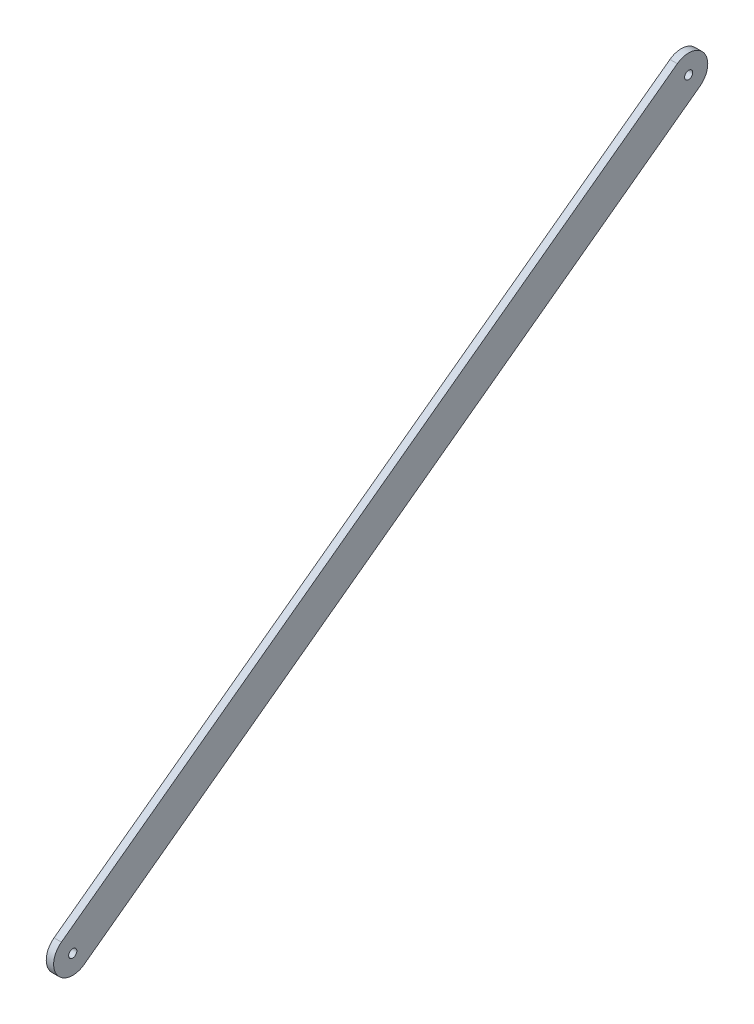
ISO-10303-21;
HEADER;
FILE_DESCRIPTION(('STEP AP214'),'2;1');
FILE_NAME('part.step','',(''),(''),'','','');
FILE_SCHEMA(('AUTOMOTIVE_DESIGN { 1 0 10303 214 1 1 1 1 }'));
ENDSEC;
DATA;
#1=APPLICATION_CONTEXT('core data for automotive mechanical design processes');
#2=APPLICATION_PROTOCOL_DEFINITION('international standard','automotive_design',2000,#1);
#3=PRODUCT_CONTEXT('',#1,'mechanical');
#4=PRODUCT('Part','Part','',(#3));
#5=PRODUCT_RELATED_PRODUCT_CATEGORY('part','',(#4));
#6=PRODUCT_DEFINITION_FORMATION('','',#4);
#7=PRODUCT_DEFINITION_CONTEXT('part definition',#1,'design');
#8=PRODUCT_DEFINITION('design','',#6,#7);
#9=PRODUCT_DEFINITION_SHAPE('','',#8);
#10=(LENGTH_UNIT() NAMED_UNIT(*) SI_UNIT(.MILLI.,.METRE.));
#11=(NAMED_UNIT(*) PLANE_ANGLE_UNIT() SI_UNIT($,.RADIAN.));
#12=(NAMED_UNIT(*) SI_UNIT($,.STERADIAN.) SOLID_ANGLE_UNIT());
#13=UNCERTAINTY_MEASURE_WITH_UNIT(LENGTH_MEASURE(1.E-05),#10,'distance_accuracy_value','');
#14=(GEOMETRIC_REPRESENTATION_CONTEXT(3) GLOBAL_UNCERTAINTY_ASSIGNED_CONTEXT((#13)) GLOBAL_UNIT_ASSIGNED_CONTEXT((#10,
#11,#12)) REPRESENTATION_CONTEXT('',''));
#15=CARTESIAN_POINT('',(0.,0.,0.));
#16=DIRECTION('',(0.,0.,1.));
#17=DIRECTION('',(1.,0.,0.));
#18=AXIS2_PLACEMENT_3D('',#15,#16,#17);
#19=CARTESIAN_POINT('',(-6.39999999999995,88.6597836815375,395.350407210465));
#20=DIRECTION('',(-1.,0.,0.));
#21=DIRECTION('',(0.,0.,1.));
#22=AXIS2_PLACEMENT_3D('',#19,#20,#21);
#23=PLANE('',#22);
#24=CARTESIAN_POINT('',(-6.39999999999991,88.6597836815375,395.350407210465));
#25=DIRECTION('',(-1.,0.,0.));
#26=DIRECTION('',(0.,0.,1.));
#27=AXIS2_PLACEMENT_3D('',#24,#25,#26);
#28=CIRCLE('',#27,1.6);
#29=CARTESIAN_POINT('',(-6.39999999999991,88.6597836815375,396.950407210465));
#30=VERTEX_POINT('',#29);
#31=EDGE_CURVE('E118',#30,#30,#28,.T.);
#32=ORIENTED_EDGE('',*,*,#31,.F.);
#33=EDGE_LOOP('',(#32));
#34=FACE_BOUND('',#33,.T.);
#35=CARTESIAN_POINT('',(-6.39999999999997,266.341700740396,153.629211718036));
#36=DIRECTION('',(-1.,0.,0.));
#37=DIRECTION('',(0.,0.,1.));
#38=AXIS2_PLACEMENT_3D('',#35,#36,#37);
#39=CIRCLE('',#38,1.59999999999999);
#40=CARTESIAN_POINT('',(-6.39999999999997,266.341700740396,155.229211718036));
#41=VERTEX_POINT('',#40);
#42=EDGE_CURVE('E112',#41,#41,#39,.T.);
#43=ORIENTED_EDGE('',*,*,#42,.F.);
#44=EDGE_LOOP('',(#43));
#45=FACE_BOUND('',#44,.T.);
#46=CARTESIAN_POINT('',(-6.39999999999995,88.6597836815375,395.350407210465));
#47=DIRECTION('',(-1.,0.,0.));
#48=DIRECTION('',(0.,0.,1.));
#49=AXIS2_PLACEMENT_3D('',#46,#47,#48);
#50=CIRCLE('',#49,7.50000000000018);
#51=CARTESIAN_POINT('',(-6.39999999999995,82.6167537942266,390.908359283994));
#52=VERTEX_POINT('',#51);
#53=CARTESIAN_POINT('',(-6.39999999999995,94.7028135688484,399.792455136937));
#54=VERTEX_POINT('',#53);
#55=EDGE_CURVE('E84',#52,#54,#50,.T.);
#56=ORIENTED_EDGE('',*,*,#55,.T.);
#57=DIRECTION('',(0.,0.592273056862867,-0.805737318308092));
#58=VECTOR('',#57,1.);
#59=CARTESIAN_POINT('',(-6.39999999999998,272.384730627709,158.071259644509));
#60=LINE('',#59,#58);
#61=CARTESIAN_POINT('',(-6.39999999999998,272.384730627709,158.071259644509));
#62=VERTEX_POINT('',#61);
#63=EDGE_CURVE('E80',#54,#62,#60,.T.);
#64=ORIENTED_EDGE('',*,*,#63,.T.);
#65=CARTESIAN_POINT('',(-6.39999999999998,266.341700740398,153.629211718038));
#66=DIRECTION('',(-1.,0.,0.));
#67=DIRECTION('',(0.,0.,1.));
#68=AXIS2_PLACEMENT_3D('',#65,#66,#67);
#69=CIRCLE('',#68,7.50000000000001);
#70=CARTESIAN_POINT('',(-6.39999999999998,260.298670853087,149.187163791566));
#71=VERTEX_POINT('',#70);
#72=EDGE_CURVE('E82',#62,#71,#69,.T.);
#73=ORIENTED_EDGE('',*,*,#72,.T.);
#74=DIRECTION('',(0.,-0.592273056862867,0.805737318308091));
#75=VECTOR('',#74,1.);
#76=CARTESIAN_POINT('',(-6.39999999999998,260.298670853087,149.187163791566));
#77=LINE('',#76,#75);
#78=EDGE_CURVE('E50',#71,#52,#77,.T.);
#79=ORIENTED_EDGE('',*,*,#78,.T.);
#80=EDGE_LOOP('',(#56,#64,#73,#79));
#81=FACE_BOUND('',#80,.T.);
#82=ADVANCED_FACE('F33',(#34,#45,#81),#23,.T.);
#83=CARTESIAN_POINT('',(-3.49999999999995,88.6597836815375,395.350407210465));
#84=DIRECTION('',(-1.,0.,0.));
#85=DIRECTION('',(0.,0.,1.));
#86=AXIS2_PLACEMENT_3D('',#83,#84,#85);
#87=PLANE('',#86);
#88=CARTESIAN_POINT('',(-3.49999999999989,88.6597836815375,395.350407210465));
#89=DIRECTION('',(-1.,0.,0.));
#90=DIRECTION('',(0.,0.,1.));
#91=AXIS2_PLACEMENT_3D('',#88,#89,#90);
#92=CIRCLE('',#91,1.6);
#93=CARTESIAN_POINT('',(-3.49999999999989,88.6597836815375,396.950407210465));
#94=VERTEX_POINT('',#93);
#95=EDGE_CURVE('E115',#94,#94,#92,.T.);
#96=ORIENTED_EDGE('',*,*,#95,.T.);
#97=EDGE_LOOP('',(#96));
#98=FACE_BOUND('',#97,.T.);
#99=CARTESIAN_POINT('',(-3.49999999999995,266.341700740396,153.629211718036));
#100=DIRECTION('',(-1.,0.,0.));
#101=DIRECTION('',(0.,0.,1.));
#102=AXIS2_PLACEMENT_3D('',#99,#100,#101);
#103=CIRCLE('',#102,1.59999999999999);
#104=CARTESIAN_POINT('',(-3.49999999999995,266.341700740396,155.229211718036));
#105=VERTEX_POINT('',#104);
#106=EDGE_CURVE('E99',#105,#105,#103,.T.);
#107=ORIENTED_EDGE('',*,*,#106,.T.);
#108=EDGE_LOOP('',(#107));
#109=FACE_BOUND('',#108,.T.);
#110=CARTESIAN_POINT('',(-3.49999999999995,88.6597836815375,395.350407210465));
#111=DIRECTION('',(-1.,0.,0.));
#112=DIRECTION('',(0.,0.,1.));
#113=AXIS2_PLACEMENT_3D('',#110,#111,#112);
#114=CIRCLE('',#113,7.50000000000018);
#115=CARTESIAN_POINT('',(-3.49999999999995,82.6167537942266,390.908359283994));
#116=VERTEX_POINT('',#115);
#117=CARTESIAN_POINT('',(-3.49999999999995,94.7028135688484,399.792455136937));
#118=VERTEX_POINT('',#117);
#119=EDGE_CURVE('E96',#116,#118,#114,.T.);
#120=ORIENTED_EDGE('',*,*,#119,.F.);
#121=DIRECTION('',(0.,-0.592273056862867,0.805737318308091));
#122=VECTOR('',#121,1.);
#123=CARTESIAN_POINT('',(-3.49999999999998,260.298670853087,149.187163791566));
#124=LINE('',#123,#122);
#125=CARTESIAN_POINT('',(-3.49999999999998,260.298670853087,149.187163791566));
#126=VERTEX_POINT('',#125);
#127=EDGE_CURVE('E73',#126,#116,#124,.T.);
#128=ORIENTED_EDGE('',*,*,#127,.F.);
#129=CARTESIAN_POINT('',(-3.49999999999998,266.341700740398,153.629211718038));
#130=DIRECTION('',(-1.,0.,0.));
#131=DIRECTION('',(0.,0.,1.));
#132=AXIS2_PLACEMENT_3D('',#129,#130,#131);
#133=CIRCLE('',#132,7.50000000000001);
#134=CARTESIAN_POINT('',(-3.49999999999998,272.384730627709,158.071259644509));
#135=VERTEX_POINT('',#134);
#136=EDGE_CURVE('E67',#135,#126,#133,.T.);
#137=ORIENTED_EDGE('',*,*,#136,.F.);
#138=DIRECTION('',(0.,0.592273056862867,-0.805737318308092));
#139=VECTOR('',#138,1.);
#140=CARTESIAN_POINT('',(-3.49999999999998,272.384730627709,158.071259644509));
#141=LINE('',#140,#139);
#142=EDGE_CURVE('E88',#118,#135,#141,.T.);
#143=ORIENTED_EDGE('',*,*,#142,.F.);
#144=EDGE_LOOP('',(#120,#128,#137,#143));
#145=FACE_BOUND('',#144,.T.);
#146=ADVANCED_FACE('F107',(#98,#109,#145),#87,.F.);
#147=CARTESIAN_POINT('',(-6.39999999999995,88.6597836815375,395.350407210465));
#148=DIRECTION('',(1.,0.,0.));
#149=DIRECTION('',(0.,0.,-1.));
#150=AXIS2_PLACEMENT_3D('',#147,#148,#149);
#151=CYLINDRICAL_SURFACE('',#150,7.50000000000018);
#152=ORIENTED_EDGE('',*,*,#119,.T.);
#153=DIRECTION('',(1.,0.,0.));
#154=VECTOR('',#153,1.);
#155=CARTESIAN_POINT('',(-6.39999999999995,94.7028135688484,399.792455136937));
#156=LINE('',#155,#154);
#157=EDGE_CURVE('E11',#54,#118,#156,.T.);
#158=ORIENTED_EDGE('',*,*,#157,.F.);
#159=ORIENTED_EDGE('',*,*,#55,.F.);
#160=DIRECTION('',(1.,0.,0.));
#161=VECTOR('',#160,1.);
#162=CARTESIAN_POINT('',(-6.39999999999995,82.6167537942266,390.908359283994));
#163=LINE('',#162,#161);
#164=EDGE_CURVE('E92',#52,#116,#163,.T.);
#165=ORIENTED_EDGE('',*,*,#164,.T.);
#166=EDGE_LOOP('',(#152,#158,#159,#165));
#167=FACE_BOUND('',#166,.T.);
#168=ADVANCED_FACE('F35',(#167),#151,.T.);
#169=CARTESIAN_POINT('',(-6.39999999999998,272.384730627709,158.071259644509));
#170=DIRECTION('',(0.,-0.805737318308092,-0.592273056862866));
#171=DIRECTION('',(0.,0.592273056862867,-0.805737318308092));
#172=AXIS2_PLACEMENT_3D('',#169,#170,#171);
#173=PLANE('',#172);
#174=ORIENTED_EDGE('',*,*,#142,.T.);
#175=DIRECTION('',(1.,0.,0.));
#176=VECTOR('',#175,1.);
#177=CARTESIAN_POINT('',(-6.39999999999998,272.384730627709,158.071259644509));
#178=LINE('',#177,#176);
#179=EDGE_CURVE('E42',#62,#135,#178,.T.);
#180=ORIENTED_EDGE('',*,*,#179,.F.);
#181=ORIENTED_EDGE('',*,*,#63,.F.);
#182=ORIENTED_EDGE('',*,*,#157,.T.);
#183=EDGE_LOOP('',(#174,#180,#181,#182));
#184=FACE_BOUND('',#183,.T.);
#185=ADVANCED_FACE('F87',(#184),#173,.F.);
#186=CARTESIAN_POINT('',(-6.39999999999998,266.341700740398,153.629211718038));
#187=DIRECTION('',(1.,0.,0.));
#188=DIRECTION('',(0.,0.,-1.));
#189=AXIS2_PLACEMENT_3D('',#186,#187,#188);
#190=CYLINDRICAL_SURFACE('',#189,7.50000000000001);
#191=ORIENTED_EDGE('',*,*,#136,.T.);
#192=DIRECTION('',(1.,0.,0.));
#193=VECTOR('',#192,1.);
#194=CARTESIAN_POINT('',(-6.39999999999998,260.298670853087,149.187163791566));
#195=LINE('',#194,#193);
#196=EDGE_CURVE('E89',#71,#126,#195,.T.);
#197=ORIENTED_EDGE('',*,*,#196,.F.);
#198=ORIENTED_EDGE('',*,*,#72,.F.);
#199=ORIENTED_EDGE('',*,*,#179,.T.);
#200=EDGE_LOOP('',(#191,#197,#198,#199));
#201=FACE_BOUND('',#200,.T.);
#202=ADVANCED_FACE('F90',(#201),#190,.T.);
#203=CARTESIAN_POINT('',(-6.39999999999998,260.298670853087,149.187163791566));
#204=DIRECTION('',(0.,0.805737318308091,0.592273056862867));
#205=DIRECTION('',(0.,-0.592273056862867,0.805737318308091));
#206=AXIS2_PLACEMENT_3D('',#203,#204,#205);
#207=PLANE('',#206);
#208=ORIENTED_EDGE('',*,*,#127,.T.);
#209=ORIENTED_EDGE('',*,*,#164,.F.);
#210=ORIENTED_EDGE('',*,*,#78,.F.);
#211=ORIENTED_EDGE('',*,*,#196,.T.);
#212=EDGE_LOOP('',(#208,#209,#210,#211));
#213=FACE_BOUND('',#212,.T.);
#214=ADVANCED_FACE('F104',(#213),#207,.F.);
#215=CARTESIAN_POINT('',(-6.39999999999997,266.341700740396,153.629211718036));
#216=DIRECTION('',(-1.,0.,0.));
#217=DIRECTION('',(0.,0.,1.));
#218=AXIS2_PLACEMENT_3D('',#215,#216,#217);
#219=CYLINDRICAL_SURFACE('',#218,1.59999999999999);
#220=ORIENTED_EDGE('',*,*,#106,.F.);
#221=EDGE_LOOP('',(#220));
#222=FACE_BOUND('',#221,.T.);
#223=ORIENTED_EDGE('',*,*,#42,.T.);
#224=EDGE_LOOP('',(#223));
#225=FACE_BOUND('',#224,.T.);
#226=ADVANCED_FACE('F129',(#222,#225),#219,.F.);
#227=CARTESIAN_POINT('',(-6.39999999999991,88.6597836815375,395.350407210465));
#228=DIRECTION('',(-1.,0.,0.));
#229=DIRECTION('',(0.,0.,1.));
#230=AXIS2_PLACEMENT_3D('',#227,#228,#229);
#231=CYLINDRICAL_SURFACE('',#230,1.6);
#232=ORIENTED_EDGE('',*,*,#95,.F.);
#233=EDGE_LOOP('',(#232));
#234=FACE_BOUND('',#233,.T.);
#235=ORIENTED_EDGE('',*,*,#31,.T.);
#236=EDGE_LOOP('',(#235));
#237=FACE_BOUND('',#236,.T.);
#238=ADVANCED_FACE('F122',(#234,#237),#231,.F.);
#239=CLOSED_SHELL('',(#82,#146,#168,#185,#202,#214,#226,#238));
#240=MANIFOLD_SOLID_BREP('B2',#239);
#241=ADVANCED_BREP_SHAPE_REPRESENTATION('',(#18,#240),#14);
#242=SHAPE_DEFINITION_REPRESENTATION(#9,#241);
ENDSEC;
END-ISO-10303-21;
